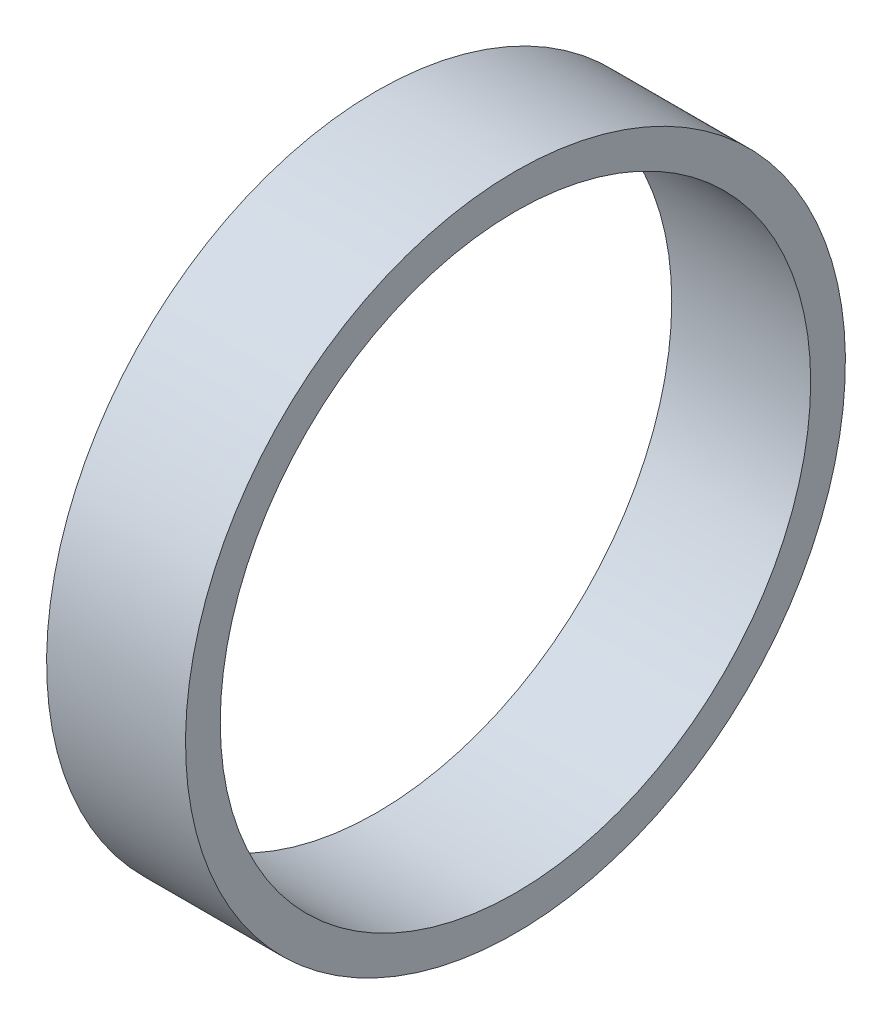
ISO-10303-21;
HEADER;
FILE_DESCRIPTION(('STEP AP214'),'2;1');
FILE_NAME('part.step','',(''),(''),'','','');
FILE_SCHEMA(('AUTOMOTIVE_DESIGN { 1 0 10303 214 1 1 1 1 }'));
ENDSEC;
DATA;
#1=APPLICATION_CONTEXT('core data for automotive mechanical design processes');
#2=APPLICATION_PROTOCOL_DEFINITION('international standard','automotive_design',2000,#1);
#3=PRODUCT_CONTEXT('',#1,'mechanical');
#4=PRODUCT('Part','Part','',(#3));
#5=PRODUCT_RELATED_PRODUCT_CATEGORY('part','',(#4));
#6=PRODUCT_DEFINITION_FORMATION('','',#4);
#7=PRODUCT_DEFINITION_CONTEXT('part definition',#1,'design');
#8=PRODUCT_DEFINITION('design','',#6,#7);
#9=PRODUCT_DEFINITION_SHAPE('','',#8);
#10=(LENGTH_UNIT() NAMED_UNIT(*) SI_UNIT(.MILLI.,.METRE.));
#11=(NAMED_UNIT(*) PLANE_ANGLE_UNIT() SI_UNIT($,.RADIAN.));
#12=(NAMED_UNIT(*) SI_UNIT($,.STERADIAN.) SOLID_ANGLE_UNIT());
#13=UNCERTAINTY_MEASURE_WITH_UNIT(LENGTH_MEASURE(1.E-05),#10,'distance_accuracy_value','');
#14=(GEOMETRIC_REPRESENTATION_CONTEXT(3) GLOBAL_UNCERTAINTY_ASSIGNED_CONTEXT((#13)) GLOBAL_UNIT_ASSIGNED_CONTEXT((#10,
#11,#12)) REPRESENTATION_CONTEXT('',''));
#15=CARTESIAN_POINT('',(0.,0.,0.));
#16=DIRECTION('',(0.,0.,1.));
#17=DIRECTION('',(1.,0.,0.));
#18=AXIS2_PLACEMENT_3D('',#15,#16,#17);
#19=CARTESIAN_POINT('',(0.,0.,0.));
#20=DIRECTION('',(-1.,0.,0.));
#21=DIRECTION('',(0.,0.,1.));
#22=AXIS2_PLACEMENT_3D('',#19,#20,#21);
#23=CYLINDRICAL_SURFACE('',#22,170.);
#24=CARTESIAN_POINT('',(1100.,0.,0.));
#25=DIRECTION('',(-1.,0.,0.));
#26=DIRECTION('',(0.,0.,1.));
#27=AXIS2_PLACEMENT_3D('',#24,#25,#26);
#28=CIRCLE('',#27,170.);
#29=CARTESIAN_POINT('',(1100.,170.,-1.22052963014615E-06));
#30=VERTEX_POINT('',#29);
#31=CARTESIAN_POINT('',(1100.,170.,0.));
#32=VERTEX_POINT('',#31);
#33=EDGE_CURVE('E11',#30,#32,#28,.T.);
#34=ORIENTED_EDGE('',*,*,#33,.T.);
#35=DIRECTION('',(1.,0.,0.));
#36=VECTOR('',#35,1.);
#37=CARTESIAN_POINT('',(1180.,170.,0.));
#38=LINE('',#37,#36);
#39=CARTESIAN_POINT('',(1180.,170.,0.));
#40=VERTEX_POINT('',#39);
#41=EDGE_CURVE('E100',#32,#40,#38,.T.);
#42=ORIENTED_EDGE('',*,*,#41,.T.);
#43=CARTESIAN_POINT('',(1180.,0.,0.));
#44=DIRECTION('',(-1.,0.,0.));
#45=DIRECTION('',(0.,0.,1.));
#46=AXIS2_PLACEMENT_3D('',#43,#44,#45);
#47=CIRCLE('',#46,170.);
#48=CARTESIAN_POINT('',(1180.,170.,-1.22052963014615E-06));
#49=VERTEX_POINT('',#48);
#50=EDGE_CURVE('E80',#49,#40,#47,.T.);
#51=ORIENTED_EDGE('',*,*,#50,.F.);
#52=DIRECTION('',(1.,0.,0.));
#53=VECTOR('',#52,1.);
#54=CARTESIAN_POINT('',(1180.,170.,-1.22052963014615E-06));
#55=LINE('',#54,#53);
#56=EDGE_CURVE('E103',#30,#49,#55,.T.);
#57=ORIENTED_EDGE('',*,*,#56,.F.);
#58=EDGE_LOOP('',(#34,#42,#51,#57));
#59=FACE_BOUND('',#58,.T.);
#60=ADVANCED_FACE('F39',(#59),#23,.F.);
#61=CARTESIAN_POINT('',(1100.,170.,-1.22052963014615E-06));
#62=DIRECTION('',(1.,0.,0.));
#63=DIRECTION('',(0.,0.,-1.));
#64=AXIS2_PLACEMENT_3D('',#61,#62,#63);
#65=PLANE('',#64);
#66=CARTESIAN_POINT('',(1100.,0.,0.));
#67=DIRECTION('',(-1.,0.,0.));
#68=DIRECTION('',(0.,0.,1.));
#69=AXIS2_PLACEMENT_3D('',#66,#67,#68);
#70=CIRCLE('',#69,190.);
#71=CARTESIAN_POINT('',(1100.,190.,-1.36412135133981E-06));
#72=VERTEX_POINT('',#71);
#73=CARTESIAN_POINT('',(1100.,190.,0.));
#74=VERTEX_POINT('',#73);
#75=EDGE_CURVE('E50',#72,#74,#70,.T.);
#76=ORIENTED_EDGE('',*,*,#75,.T.);
#77=DIRECTION('',(0.,-1.,0.));
#78=VECTOR('',#77,1.);
#79=CARTESIAN_POINT('',(1100.,170.,0.));
#80=LINE('',#79,#78);
#81=EDGE_CURVE('E104',#74,#32,#80,.T.);
#82=ORIENTED_EDGE('',*,*,#81,.T.);
#83=ORIENTED_EDGE('',*,*,#33,.F.);
#84=DIRECTION('',(0.,-1.,7.17958605968322E-09));
#85=VECTOR('',#84,1.);
#86=CARTESIAN_POINT('',(1100.,170.,-1.22052963014615E-06));
#87=LINE('',#86,#85);
#88=EDGE_CURVE('E91',#72,#30,#87,.T.);
#89=ORIENTED_EDGE('',*,*,#88,.F.);
#90=EDGE_LOOP('',(#76,#82,#83,#89));
#91=FACE_BOUND('',#90,.T.);
#92=ADVANCED_FACE('F41',(#91),#65,.F.);
#93=CARTESIAN_POINT('',(0.,0.,0.));
#94=DIRECTION('',(-1.,0.,0.));
#95=DIRECTION('',(0.,0.,1.));
#96=AXIS2_PLACEMENT_3D('',#93,#94,#95);
#97=CYLINDRICAL_SURFACE('',#96,190.);
#98=CARTESIAN_POINT('',(1180.,0.,0.));
#99=DIRECTION('',(-1.,0.,0.));
#100=DIRECTION('',(0.,0.,1.));
#101=AXIS2_PLACEMENT_3D('',#98,#99,#100);
#102=CIRCLE('',#101,190.);
#103=CARTESIAN_POINT('',(1180.,190.,-1.36412135133981E-06));
#104=VERTEX_POINT('',#103);
#105=CARTESIAN_POINT('',(1180.,190.,0.));
#106=VERTEX_POINT('',#105);
#107=EDGE_CURVE('E89',#104,#106,#102,.T.);
#108=ORIENTED_EDGE('',*,*,#107,.T.);
#109=DIRECTION('',(-1.,0.,0.));
#110=VECTOR('',#109,1.);
#111=CARTESIAN_POINT('',(1100.,190.,0.));
#112=LINE('',#111,#110);
#113=EDGE_CURVE('E97',#106,#74,#112,.T.);
#114=ORIENTED_EDGE('',*,*,#113,.T.);
#115=ORIENTED_EDGE('',*,*,#75,.F.);
#116=DIRECTION('',(-1.,0.,0.));
#117=VECTOR('',#116,1.);
#118=CARTESIAN_POINT('',(1100.,190.,-1.36412135133981E-06));
#119=LINE('',#118,#117);
#120=EDGE_CURVE('E109',#104,#72,#119,.T.);
#121=ORIENTED_EDGE('',*,*,#120,.F.);
#122=EDGE_LOOP('',(#108,#114,#115,#121));
#123=FACE_BOUND('',#122,.T.);
#124=ADVANCED_FACE('F112',(#123),#97,.T.);
#125=CARTESIAN_POINT('',(1180.,190.,-1.36412135133981E-06));
#126=DIRECTION('',(-1.,0.,0.));
#127=DIRECTION('',(0.,0.,1.));
#128=AXIS2_PLACEMENT_3D('',#125,#126,#127);
#129=PLANE('',#128);
#130=DIRECTION('',(0.,1.,-7.17958605968322E-09));
#131=VECTOR('',#130,1.);
#132=CARTESIAN_POINT('',(1180.,190.,-1.36412135133981E-06));
#133=LINE('',#132,#131);
#134=EDGE_CURVE('E82',#49,#104,#133,.T.);
#135=ORIENTED_EDGE('',*,*,#134,.F.);
#136=ORIENTED_EDGE('',*,*,#50,.T.);
#137=DIRECTION('',(0.,1.,0.));
#138=VECTOR('',#137,1.);
#139=CARTESIAN_POINT('',(1180.,190.,0.));
#140=LINE('',#139,#138);
#141=EDGE_CURVE('E85',#40,#106,#140,.T.);
#142=ORIENTED_EDGE('',*,*,#141,.T.);
#143=ORIENTED_EDGE('',*,*,#107,.F.);
#144=EDGE_LOOP('',(#135,#136,#142,#143));
#145=FACE_BOUND('',#144,.T.);
#146=ADVANCED_FACE('F83',(#145),#129,.F.);
#147=CARTESIAN_POINT('',(0.,0.,0.));
#148=DIRECTION('',(0.,-7.17958605968322E-09,-1.));
#149=DIRECTION('',(-1.,0.,0.));
#150=AXIS2_PLACEMENT_3D('',#147,#148,#149);
#151=PLANE('',#150);
#152=ORIENTED_EDGE('',*,*,#56,.T.);
#153=ORIENTED_EDGE('',*,*,#134,.T.);
#154=ORIENTED_EDGE('',*,*,#120,.T.);
#155=ORIENTED_EDGE('',*,*,#88,.T.);
#156=EDGE_LOOP('',(#152,#153,#154,#155));
#157=FACE_BOUND('',#156,.T.);
#158=ADVANCED_FACE('F111',(#157),#151,.F.);
#159=CARTESIAN_POINT('',(0.,0.,0.));
#160=DIRECTION('',(0.,0.,-1.));
#161=DIRECTION('',(-1.,0.,0.));
#162=AXIS2_PLACEMENT_3D('',#159,#160,#161);
#163=PLANE('',#162);
#164=ORIENTED_EDGE('',*,*,#41,.F.);
#165=ORIENTED_EDGE('',*,*,#81,.F.);
#166=ORIENTED_EDGE('',*,*,#113,.F.);
#167=ORIENTED_EDGE('',*,*,#141,.F.);
#168=EDGE_LOOP('',(#164,#165,#166,#167));
#169=FACE_BOUND('',#168,.T.);
#170=ADVANCED_FACE('F94',(#169),#163,.T.);
#171=CLOSED_SHELL('',(#60,#92,#124,#146,#158,#170));
#172=MANIFOLD_SOLID_BREP('B2',#171);
#173=ADVANCED_BREP_SHAPE_REPRESENTATION('',(#18,#172),#14);
#174=SHAPE_DEFINITION_REPRESENTATION(#9,#173);
ENDSEC;
END-ISO-10303-21;
